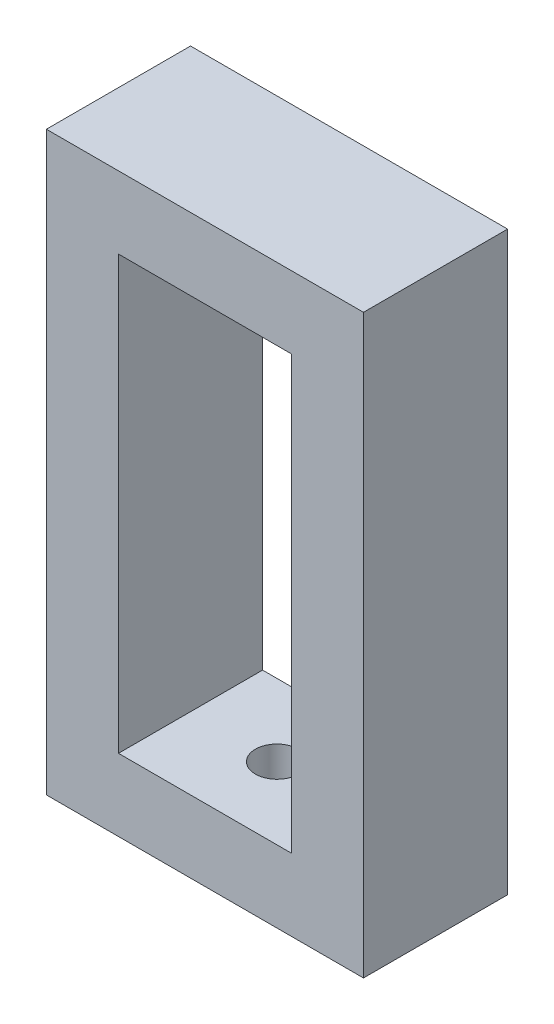
ISO-10303-21;
HEADER;
FILE_DESCRIPTION(('STEP AP214'),'2;1');
FILE_NAME('part.step','',(''),(''),'','','');
FILE_SCHEMA(('AUTOMOTIVE_DESIGN { 1 0 10303 214 1 1 1 1 }'));
ENDSEC;
DATA;
#1=APPLICATION_CONTEXT('core data for automotive mechanical design processes');
#2=APPLICATION_PROTOCOL_DEFINITION('international standard','automotive_design',2000,#1);
#3=PRODUCT_CONTEXT('',#1,'mechanical');
#4=PRODUCT('Part','Part','',(#3));
#5=PRODUCT_RELATED_PRODUCT_CATEGORY('part','',(#4));
#6=PRODUCT_DEFINITION_FORMATION('','',#4);
#7=PRODUCT_DEFINITION_CONTEXT('part definition',#1,'design');
#8=PRODUCT_DEFINITION('design','',#6,#7);
#9=PRODUCT_DEFINITION_SHAPE('','',#8);
#10=(LENGTH_UNIT() NAMED_UNIT(*) SI_UNIT(.MILLI.,.METRE.));
#11=(NAMED_UNIT(*) PLANE_ANGLE_UNIT() SI_UNIT($,.RADIAN.));
#12=(NAMED_UNIT(*) SI_UNIT($,.STERADIAN.) SOLID_ANGLE_UNIT());
#13=UNCERTAINTY_MEASURE_WITH_UNIT(LENGTH_MEASURE(1.E-05),#10,'distance_accuracy_value','');
#14=(GEOMETRIC_REPRESENTATION_CONTEXT(3) GLOBAL_UNCERTAINTY_ASSIGNED_CONTEXT((#13)) GLOBAL_UNIT_ASSIGNED_CONTEXT((#10,
#11,#12)) REPRESENTATION_CONTEXT('',''));
#15=CARTESIAN_POINT('',(0.,0.,0.));
#16=DIRECTION('',(0.,0.,1.));
#17=DIRECTION('',(1.,0.,0.));
#18=AXIS2_PLACEMENT_3D('',#15,#16,#17);
#19=CARTESIAN_POINT('',(0.,0.,10.));
#20=DIRECTION('',(0.,0.,1.));
#21=DIRECTION('',(1.,0.,0.));
#22=AXIS2_PLACEMENT_3D('',#19,#20,#21);
#23=PLANE('',#22);
#24=DIRECTION('',(0.,-1.,0.));
#25=VECTOR('',#24,1.);
#26=CARTESIAN_POINT('',(0.,40.,10.));
#27=LINE('',#26,#25);
#28=CARTESIAN_POINT('',(0.,40.,10.));
#29=VERTEX_POINT('',#28);
#30=CARTESIAN_POINT('',(0.,0.,10.));
#31=VERTEX_POINT('',#30);
#32=EDGE_CURVE('E144',#29,#31,#27,.T.);
#33=ORIENTED_EDGE('',*,*,#32,.T.);
#34=DIRECTION('',(1.,0.,0.));
#35=VECTOR('',#34,1.);
#36=CARTESIAN_POINT('',(0.,0.,10.));
#37=LINE('',#36,#35);
#38=CARTESIAN_POINT('',(22.,0.,10.));
#39=VERTEX_POINT('',#38);
#40=EDGE_CURVE('E146',#31,#39,#37,.T.);
#41=ORIENTED_EDGE('',*,*,#40,.T.);
#42=DIRECTION('',(0.,1.,0.));
#43=VECTOR('',#42,1.);
#44=CARTESIAN_POINT('',(22.,0.,10.));
#45=LINE('',#44,#43);
#46=CARTESIAN_POINT('',(22.,40.,10.));
#47=VERTEX_POINT('',#46);
#48=EDGE_CURVE('E151',#39,#47,#45,.T.);
#49=ORIENTED_EDGE('',*,*,#48,.T.);
#50=DIRECTION('',(-1.,0.,0.));
#51=VECTOR('',#50,1.);
#52=CARTESIAN_POINT('',(22.,40.,10.));
#53=LINE('',#52,#51);
#54=EDGE_CURVE('E153',#47,#29,#53,.T.);
#55=ORIENTED_EDGE('',*,*,#54,.T.);
#56=EDGE_LOOP('',(#33,#41,#49,#55));
#57=FACE_BOUND('',#56,.T.);
#58=DIRECTION('',(1.,0.,0.));
#59=VECTOR('',#58,1.);
#60=CARTESIAN_POINT('',(5.,5.,10.));
#61=LINE('',#60,#59);
#62=CARTESIAN_POINT('',(5.,5.,10.));
#63=VERTEX_POINT('',#62);
#64=CARTESIAN_POINT('',(17.,5.,10.));
#65=VERTEX_POINT('',#64);
#66=EDGE_CURVE('E113',#63,#65,#61,.T.);
#67=ORIENTED_EDGE('',*,*,#66,.F.);
#68=DIRECTION('',(0.,-1.,0.));
#69=VECTOR('',#68,1.);
#70=CARTESIAN_POINT('',(5.,35.,10.));
#71=LINE('',#70,#69);
#72=CARTESIAN_POINT('',(5.,35.,10.));
#73=VERTEX_POINT('',#72);
#74=EDGE_CURVE('E110',#73,#63,#71,.T.);
#75=ORIENTED_EDGE('',*,*,#74,.F.);
#76=DIRECTION('',(-1.,0.,0.));
#77=VECTOR('',#76,1.);
#78=CARTESIAN_POINT('',(17.,35.,10.));
#79=LINE('',#78,#77);
#80=CARTESIAN_POINT('',(17.,35.,10.));
#81=VERTEX_POINT('',#80);
#82=EDGE_CURVE('E129',#81,#73,#79,.T.);
#83=ORIENTED_EDGE('',*,*,#82,.F.);
#84=DIRECTION('',(0.,1.,0.));
#85=VECTOR('',#84,1.);
#86=CARTESIAN_POINT('',(17.,5.,10.));
#87=LINE('',#86,#85);
#88=EDGE_CURVE('E130',#65,#81,#87,.T.);
#89=ORIENTED_EDGE('',*,*,#88,.F.);
#90=EDGE_LOOP('',(#67,#75,#83,#89));
#91=FACE_BOUND('',#90,.T.);
#92=ADVANCED_FACE('F41',(#57,#91),#23,.T.);
#93=CARTESIAN_POINT('',(0.,0.,0.));
#94=DIRECTION('',(0.,0.,1.));
#95=DIRECTION('',(1.,0.,0.));
#96=AXIS2_PLACEMENT_3D('',#93,#94,#95);
#97=PLANE('',#96);
#98=DIRECTION('',(0.,-1.,0.));
#99=VECTOR('',#98,1.);
#100=CARTESIAN_POINT('',(0.,40.,0.));
#101=LINE('',#100,#99);
#102=CARTESIAN_POINT('',(0.,40.,0.));
#103=VERTEX_POINT('',#102);
#104=CARTESIAN_POINT('',(0.,0.,0.));
#105=VERTEX_POINT('',#104);
#106=EDGE_CURVE('E123',#103,#105,#101,.T.);
#107=ORIENTED_EDGE('',*,*,#106,.F.);
#108=DIRECTION('',(-1.,0.,0.));
#109=VECTOR('',#108,1.);
#110=CARTESIAN_POINT('',(22.,40.,0.));
#111=LINE('',#110,#109);
#112=CARTESIAN_POINT('',(22.,40.,0.));
#113=VERTEX_POINT('',#112);
#114=EDGE_CURVE('E149',#113,#103,#111,.T.);
#115=ORIENTED_EDGE('',*,*,#114,.F.);
#116=DIRECTION('',(0.,1.,0.));
#117=VECTOR('',#116,1.);
#118=CARTESIAN_POINT('',(22.,0.,0.));
#119=LINE('',#118,#117);
#120=CARTESIAN_POINT('',(22.,0.,0.));
#121=VERTEX_POINT('',#120);
#122=EDGE_CURVE('E159',#121,#113,#119,.T.);
#123=ORIENTED_EDGE('',*,*,#122,.F.);
#124=DIRECTION('',(1.,0.,0.));
#125=VECTOR('',#124,1.);
#126=CARTESIAN_POINT('',(0.,0.,0.));
#127=LINE('',#126,#125);
#128=EDGE_CURVE('E158',#105,#121,#127,.T.);
#129=ORIENTED_EDGE('',*,*,#128,.F.);
#130=EDGE_LOOP('',(#107,#115,#123,#129));
#131=FACE_BOUND('',#130,.T.);
#132=DIRECTION('',(0.,-1.,0.));
#133=VECTOR('',#132,1.);
#134=CARTESIAN_POINT('',(5.,35.,0.));
#135=LINE('',#134,#133);
#136=CARTESIAN_POINT('',(5.,35.,0.));
#137=VERTEX_POINT('',#136);
#138=CARTESIAN_POINT('',(5.,5.,0.));
#139=VERTEX_POINT('',#138);
#140=EDGE_CURVE('E62',#137,#139,#135,.T.);
#141=ORIENTED_EDGE('',*,*,#140,.T.);
#142=DIRECTION('',(1.,0.,0.));
#143=VECTOR('',#142,1.);
#144=CARTESIAN_POINT('',(5.,5.,0.));
#145=LINE('',#144,#143);
#146=CARTESIAN_POINT('',(17.,5.,0.));
#147=VERTEX_POINT('',#146);
#148=EDGE_CURVE('E125',#139,#147,#145,.T.);
#149=ORIENTED_EDGE('',*,*,#148,.T.);
#150=DIRECTION('',(0.,1.,0.));
#151=VECTOR('',#150,1.);
#152=CARTESIAN_POINT('',(17.,5.,0.));
#153=LINE('',#152,#151);
#154=CARTESIAN_POINT('',(17.,35.,0.));
#155=VERTEX_POINT('',#154);
#156=EDGE_CURVE('E140',#147,#155,#153,.T.);
#157=ORIENTED_EDGE('',*,*,#156,.T.);
#158=DIRECTION('',(-1.,0.,0.));
#159=VECTOR('',#158,1.);
#160=CARTESIAN_POINT('',(17.,35.,0.));
#161=LINE('',#160,#159);
#162=EDGE_CURVE('E119',#155,#137,#161,.T.);
#163=ORIENTED_EDGE('',*,*,#162,.T.);
#164=EDGE_LOOP('',(#141,#149,#157,#163));
#165=FACE_BOUND('',#164,.T.);
#166=ADVANCED_FACE('F177',(#131,#165),#97,.F.);
#167=CARTESIAN_POINT('',(0.,40.,10.));
#168=DIRECTION('',(1.,0.,0.));
#169=DIRECTION('',(0.,0.,-1.));
#170=AXIS2_PLACEMENT_3D('',#167,#168,#169);
#171=PLANE('',#170);
#172=ORIENTED_EDGE('',*,*,#106,.T.);
#173=DIRECTION('',(0.,0.,-1.));
#174=VECTOR('',#173,1.);
#175=CARTESIAN_POINT('',(0.,0.,10.));
#176=LINE('',#175,#174);
#177=EDGE_CURVE('E11',#31,#105,#176,.T.);
#178=ORIENTED_EDGE('',*,*,#177,.F.);
#179=ORIENTED_EDGE('',*,*,#32,.F.);
#180=DIRECTION('',(0.,0.,-1.));
#181=VECTOR('',#180,1.);
#182=CARTESIAN_POINT('',(0.,40.,10.));
#183=LINE('',#182,#181);
#184=EDGE_CURVE('E154',#29,#103,#183,.T.);
#185=ORIENTED_EDGE('',*,*,#184,.T.);
#186=EDGE_LOOP('',(#172,#178,#179,#185));
#187=FACE_BOUND('',#186,.T.);
#188=ADVANCED_FACE('F43',(#187),#171,.F.);
#189=CARTESIAN_POINT('',(0.,0.,10.));
#190=DIRECTION('',(0.,1.,0.));
#191=DIRECTION('',(0.,0.,1.));
#192=AXIS2_PLACEMENT_3D('',#189,#190,#191);
#193=PLANE('',#192);
#194=CARTESIAN_POINT('',(11.,0.,5.));
#195=DIRECTION('',(0.,1.,0.));
#196=DIRECTION('',(0.,0.,1.));
#197=AXIS2_PLACEMENT_3D('',#194,#195,#196);
#198=CIRCLE('',#197,1.5);
#199=CARTESIAN_POINT('',(11.,0.,6.5));
#200=VERTEX_POINT('',#199);
#201=EDGE_CURVE('E132',#200,#200,#198,.T.);
#202=ORIENTED_EDGE('',*,*,#201,.T.);
#203=EDGE_LOOP('',(#202));
#204=FACE_BOUND('',#203,.T.);
#205=ORIENTED_EDGE('',*,*,#128,.T.);
#206=DIRECTION('',(0.,0.,-1.));
#207=VECTOR('',#206,1.);
#208=CARTESIAN_POINT('',(22.,0.,10.));
#209=LINE('',#208,#207);
#210=EDGE_CURVE('E49',#39,#121,#209,.T.);
#211=ORIENTED_EDGE('',*,*,#210,.F.);
#212=ORIENTED_EDGE('',*,*,#40,.F.);
#213=ORIENTED_EDGE('',*,*,#177,.T.);
#214=EDGE_LOOP('',(#205,#211,#212,#213));
#215=FACE_BOUND('',#214,.T.);
#216=ADVANCED_FACE('F188',(#204,#215),#193,.F.);
#217=CARTESIAN_POINT('',(22.,0.,10.));
#218=DIRECTION('',(-1.,0.,0.));
#219=DIRECTION('',(0.,0.,1.));
#220=AXIS2_PLACEMENT_3D('',#217,#218,#219);
#221=PLANE('',#220);
#222=ORIENTED_EDGE('',*,*,#122,.T.);
#223=DIRECTION('',(0.,0.,-1.));
#224=VECTOR('',#223,1.);
#225=CARTESIAN_POINT('',(22.,40.,10.));
#226=LINE('',#225,#224);
#227=EDGE_CURVE('E164',#47,#113,#226,.T.);
#228=ORIENTED_EDGE('',*,*,#227,.F.);
#229=ORIENTED_EDGE('',*,*,#48,.F.);
#230=ORIENTED_EDGE('',*,*,#210,.T.);
#231=EDGE_LOOP('',(#222,#228,#229,#230));
#232=FACE_BOUND('',#231,.T.);
#233=ADVANCED_FACE('F175',(#232),#221,.F.);
#234=CARTESIAN_POINT('',(22.,40.,10.));
#235=DIRECTION('',(0.,-1.,0.));
#236=DIRECTION('',(0.,0.,-1.));
#237=AXIS2_PLACEMENT_3D('',#234,#235,#236);
#238=PLANE('',#237);
#239=ORIENTED_EDGE('',*,*,#114,.T.);
#240=ORIENTED_EDGE('',*,*,#184,.F.);
#241=ORIENTED_EDGE('',*,*,#54,.F.);
#242=ORIENTED_EDGE('',*,*,#227,.T.);
#243=EDGE_LOOP('',(#239,#240,#241,#242));
#244=FACE_BOUND('',#243,.T.);
#245=ADVANCED_FACE('F181',(#244),#238,.F.);
#246=CARTESIAN_POINT('',(5.,35.,10.));
#247=DIRECTION('',(1.,0.,0.));
#248=DIRECTION('',(0.,0.,-1.));
#249=AXIS2_PLACEMENT_3D('',#246,#247,#248);
#250=PLANE('',#249);
#251=ORIENTED_EDGE('',*,*,#140,.F.);
#252=DIRECTION('',(0.,0.,-1.));
#253=VECTOR('',#252,1.);
#254=CARTESIAN_POINT('',(5.,35.,10.));
#255=LINE('',#254,#253);
#256=EDGE_CURVE('E112',#73,#137,#255,.T.);
#257=ORIENTED_EDGE('',*,*,#256,.F.);
#258=ORIENTED_EDGE('',*,*,#74,.T.);
#259=DIRECTION('',(0.,0.,-1.));
#260=VECTOR('',#259,1.);
#261=CARTESIAN_POINT('',(5.,5.,10.));
#262=LINE('',#261,#260);
#263=EDGE_CURVE('E109',#63,#139,#262,.T.);
#264=ORIENTED_EDGE('',*,*,#263,.T.);
#265=EDGE_LOOP('',(#251,#257,#258,#264));
#266=FACE_BOUND('',#265,.T.);
#267=ADVANCED_FACE('F108',(#266),#250,.T.);
#268=CARTESIAN_POINT('',(5.,5.,10.));
#269=DIRECTION('',(0.,1.,0.));
#270=DIRECTION('',(0.,0.,1.));
#271=AXIS2_PLACEMENT_3D('',#268,#269,#270);
#272=PLANE('',#271);
#273=CARTESIAN_POINT('',(11.,5.,5.));
#274=DIRECTION('',(0.,1.,0.));
#275=DIRECTION('',(0.,0.,1.));
#276=AXIS2_PLACEMENT_3D('',#273,#274,#275);
#277=CIRCLE('',#276,1.5);
#278=CARTESIAN_POINT('',(11.,5.,6.5));
#279=VERTEX_POINT('',#278);
#280=EDGE_CURVE('E44',#279,#279,#277,.T.);
#281=ORIENTED_EDGE('',*,*,#280,.F.);
#282=EDGE_LOOP('',(#281));
#283=FACE_BOUND('',#282,.T.);
#284=ORIENTED_EDGE('',*,*,#148,.F.);
#285=ORIENTED_EDGE('',*,*,#263,.F.);
#286=ORIENTED_EDGE('',*,*,#66,.T.);
#287=DIRECTION('',(0.,0.,-1.));
#288=VECTOR('',#287,1.);
#289=CARTESIAN_POINT('',(17.,5.,10.));
#290=LINE('',#289,#288);
#291=EDGE_CURVE('E122',#65,#147,#290,.T.);
#292=ORIENTED_EDGE('',*,*,#291,.T.);
#293=EDGE_LOOP('',(#284,#285,#286,#292));
#294=FACE_BOUND('',#293,.T.);
#295=ADVANCED_FACE('F118',(#283,#294),#272,.T.);
#296=CARTESIAN_POINT('',(17.,5.,10.));
#297=DIRECTION('',(-1.,0.,0.));
#298=DIRECTION('',(0.,0.,1.));
#299=AXIS2_PLACEMENT_3D('',#296,#297,#298);
#300=PLANE('',#299);
#301=ORIENTED_EDGE('',*,*,#156,.F.);
#302=ORIENTED_EDGE('',*,*,#291,.F.);
#303=ORIENTED_EDGE('',*,*,#88,.T.);
#304=DIRECTION('',(0.,0.,-1.));
#305=VECTOR('',#304,1.);
#306=CARTESIAN_POINT('',(17.,35.,10.));
#307=LINE('',#306,#305);
#308=EDGE_CURVE('E60',#81,#155,#307,.T.);
#309=ORIENTED_EDGE('',*,*,#308,.T.);
#310=EDGE_LOOP('',(#301,#302,#303,#309));
#311=FACE_BOUND('',#310,.T.);
#312=ADVANCED_FACE('F216',(#311),#300,.T.);
#313=CARTESIAN_POINT('',(17.,35.,10.));
#314=DIRECTION('',(0.,-1.,0.));
#315=DIRECTION('',(0.,0.,-1.));
#316=AXIS2_PLACEMENT_3D('',#313,#314,#315);
#317=PLANE('',#316);
#318=ORIENTED_EDGE('',*,*,#162,.F.);
#319=ORIENTED_EDGE('',*,*,#308,.F.);
#320=ORIENTED_EDGE('',*,*,#82,.T.);
#321=ORIENTED_EDGE('',*,*,#256,.T.);
#322=EDGE_LOOP('',(#318,#319,#320,#321));
#323=FACE_BOUND('',#322,.T.);
#324=ADVANCED_FACE('F222',(#323),#317,.T.);
#325=CARTESIAN_POINT('',(11.,-15.,5.));
#326=DIRECTION('',(0.,1.,0.));
#327=DIRECTION('',(0.,0.,1.));
#328=AXIS2_PLACEMENT_3D('',#325,#326,#327);
#329=CYLINDRICAL_SURFACE('',#328,1.5);
#330=ORIENTED_EDGE('',*,*,#280,.T.);
#331=EDGE_LOOP('',(#330));
#332=FACE_BOUND('',#331,.T.);
#333=ORIENTED_EDGE('',*,*,#201,.F.);
#334=EDGE_LOOP('',(#333));
#335=FACE_BOUND('',#334,.T.);
#336=ADVANCED_FACE('F226',(#332,#335),#329,.F.);
#337=CLOSED_SHELL('',(#92,#166,#188,#216,#233,#245,#267,#295,#312,#324,#336));
#338=MANIFOLD_SOLID_BREP('B2',#337);
#339=ADVANCED_BREP_SHAPE_REPRESENTATION('',(#18,#338),#14);
#340=SHAPE_DEFINITION_REPRESENTATION(#9,#339);
ENDSEC;
END-ISO-10303-21;
